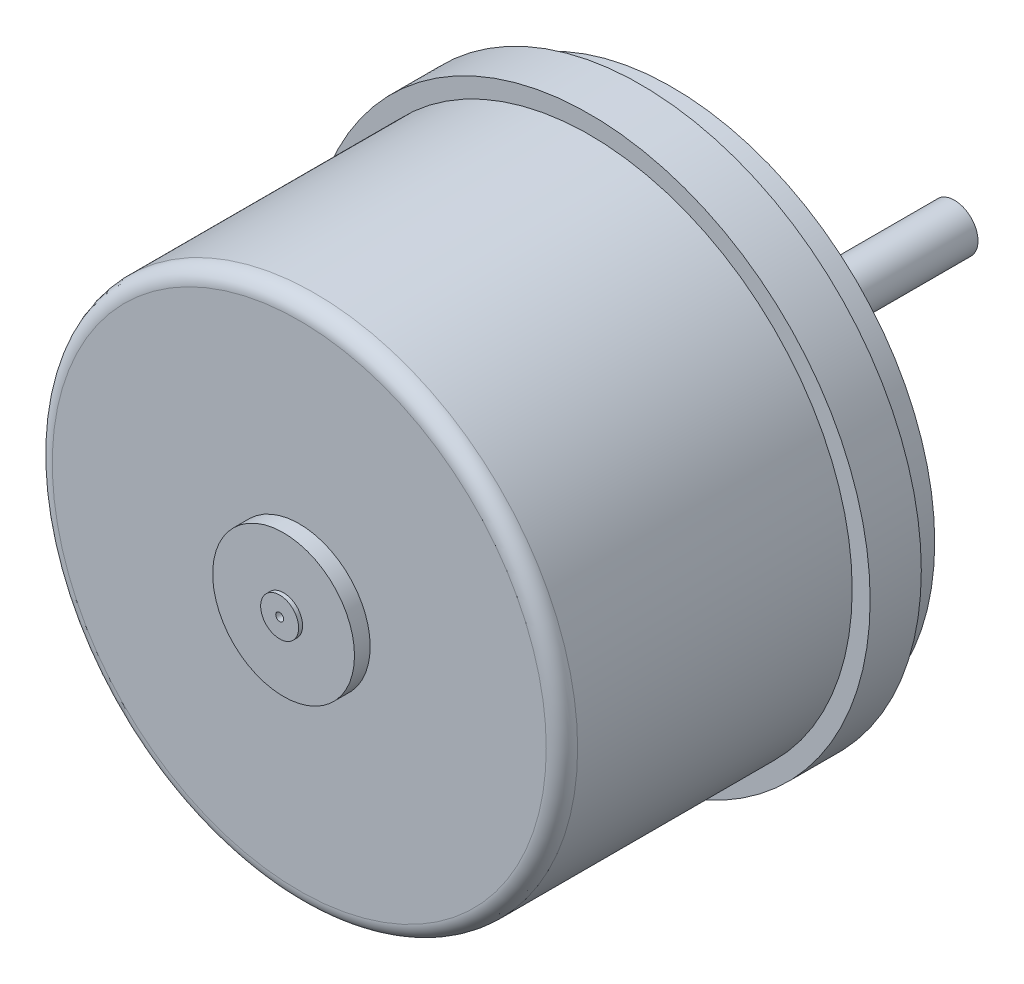
ISO-10303-21;
HEADER;
FILE_DESCRIPTION(('STEP AP214'),'2;1');
FILE_NAME('part.step','',(''),(''),'','','');
FILE_SCHEMA(('AUTOMOTIVE_DESIGN { 1 0 10303 214 1 1 1 1 }'));
ENDSEC;
DATA;
#1=APPLICATION_CONTEXT('core data for automotive mechanical design processes');
#2=APPLICATION_PROTOCOL_DEFINITION('international standard','automotive_design',2000,#1);
#3=PRODUCT_CONTEXT('',#1,'mechanical');
#4=PRODUCT('Part','Part','',(#3));
#5=PRODUCT_RELATED_PRODUCT_CATEGORY('part','',(#4));
#6=PRODUCT_DEFINITION_FORMATION('','',#4);
#7=PRODUCT_DEFINITION_CONTEXT('part definition',#1,'design');
#8=PRODUCT_DEFINITION('design','',#6,#7);
#9=PRODUCT_DEFINITION_SHAPE('','',#8);
#10=(LENGTH_UNIT() NAMED_UNIT(*) SI_UNIT(.MILLI.,.METRE.));
#11=(NAMED_UNIT(*) PLANE_ANGLE_UNIT() SI_UNIT($,.RADIAN.));
#12=(NAMED_UNIT(*) SI_UNIT($,.STERADIAN.) SOLID_ANGLE_UNIT());
#13=UNCERTAINTY_MEASURE_WITH_UNIT(LENGTH_MEASURE(1.E-05),#10,'distance_accuracy_value','');
#14=(GEOMETRIC_REPRESENTATION_CONTEXT(3) GLOBAL_UNCERTAINTY_ASSIGNED_CONTEXT((#13)) GLOBAL_UNIT_ASSIGNED_CONTEXT((#10,
#11,#12)) REPRESENTATION_CONTEXT('',''));
#15=CARTESIAN_POINT('',(0.,0.,0.));
#16=DIRECTION('',(0.,0.,1.));
#17=DIRECTION('',(1.,0.,0.));
#18=AXIS2_PLACEMENT_3D('',#15,#16,#17);
#19=CARTESIAN_POINT('',(0.,0.,2.));
#20=DIRECTION('',(0.,0.,-1.));
#21=DIRECTION('',(-1.,0.,0.));
#22=AXIS2_PLACEMENT_3D('',#19,#20,#21);
#23=CYLINDRICAL_SURFACE('',#22,33.485);
#24=CARTESIAN_POINT('',(0.,0.,2.));
#25=DIRECTION('',(0.,0.,1.));
#26=DIRECTION('',(1.,0.,0.));
#27=AXIS2_PLACEMENT_3D('',#24,#25,#26);
#28=CIRCLE('',#27,33.485);
#29=CARTESIAN_POINT('',(33.485,0.,2.));
#30=VERTEX_POINT('',#29);
#31=EDGE_CURVE('E46',#30,#30,#28,.T.);
#32=ORIENTED_EDGE('',*,*,#31,.F.);
#33=EDGE_LOOP('',(#32));
#34=FACE_BOUND('',#33,.T.);
#35=CARTESIAN_POINT('',(0.,0.,-2.));
#36=DIRECTION('',(0.,0.,1.));
#37=DIRECTION('',(1.,0.,0.));
#38=AXIS2_PLACEMENT_3D('',#35,#36,#37);
#39=CIRCLE('',#38,33.485);
#40=CARTESIAN_POINT('',(33.485,0.,-2.));
#41=VERTEX_POINT('',#40);
#42=EDGE_CURVE('E49',#41,#41,#39,.T.);
#43=ORIENTED_EDGE('',*,*,#42,.T.);
#44=EDGE_LOOP('',(#43));
#45=FACE_BOUND('',#44,.T.);
#46=ADVANCED_FACE('F31',(#34,#45),#23,.T.);
#47=CARTESIAN_POINT('',(0.,0.,-2.));
#48=DIRECTION('',(0.,0.,1.));
#49=DIRECTION('',(1.,0.,0.));
#50=AXIS2_PLACEMENT_3D('',#47,#48,#49);
#51=PLANE('',#50);
#52=CARTESIAN_POINT('',(0.,0.,-2.));
#53=DIRECTION('',(0.,0.,1.));
#54=DIRECTION('',(1.,0.,0.));
#55=AXIS2_PLACEMENT_3D('',#52,#53,#54);
#56=CIRCLE('',#55,3.);
#57=CARTESIAN_POINT('',(3.,0.,-2.));
#58=VERTEX_POINT('',#57);
#59=EDGE_CURVE('E42',#58,#58,#56,.F.);
#60=ORIENTED_EDGE('',*,*,#59,.F.);
#61=EDGE_LOOP('',(#60));
#62=FACE_BOUND('',#61,.T.);
#63=ORIENTED_EDGE('',*,*,#42,.F.);
#64=EDGE_LOOP('',(#63));
#65=FACE_BOUND('',#64,.T.);
#66=ADVANCED_FACE('F94',(#62,#65),#51,.F.);
#67=CARTESIAN_POINT('',(0.,0.,8.52));
#68=DIRECTION('',(0.,0.,-1.));
#69=DIRECTION('',(-1.,0.,0.));
#70=AXIS2_PLACEMENT_3D('',#67,#68,#69);
#71=CYLINDRICAL_SURFACE('',#70,35.775);
#72=CARTESIAN_POINT('',(0.,0.,8.52));
#73=DIRECTION('',(0.,0.,1.));
#74=DIRECTION('',(1.,0.,0.));
#75=AXIS2_PLACEMENT_3D('',#72,#73,#74);
#76=CIRCLE('',#75,35.775);
#77=CARTESIAN_POINT('',(35.775,0.,8.52));
#78=VERTEX_POINT('',#77);
#79=EDGE_CURVE('E52',#78,#78,#76,.T.);
#80=ORIENTED_EDGE('',*,*,#79,.F.);
#81=EDGE_LOOP('',(#80));
#82=FACE_BOUND('',#81,.T.);
#83=CARTESIAN_POINT('',(0.,0.,2.));
#84=DIRECTION('',(0.,0.,1.));
#85=DIRECTION('',(1.,0.,0.));
#86=AXIS2_PLACEMENT_3D('',#83,#84,#85);
#87=CIRCLE('',#86,35.775);
#88=CARTESIAN_POINT('',(35.775,0.,2.));
#89=VERTEX_POINT('',#88);
#90=EDGE_CURVE('E55',#89,#89,#87,.T.);
#91=ORIENTED_EDGE('',*,*,#90,.T.);
#92=EDGE_LOOP('',(#91));
#93=FACE_BOUND('',#92,.T.);
#94=ADVANCED_FACE('F97',(#82,#93),#71,.T.);
#95=CARTESIAN_POINT('',(0.,0.,8.52));
#96=DIRECTION('',(0.,0.,1.));
#97=DIRECTION('',(1.,0.,0.));
#98=AXIS2_PLACEMENT_3D('',#95,#96,#97);
#99=PLANE('',#98);
#100=CARTESIAN_POINT('',(0.,0.,8.52));
#101=DIRECTION('',(0.,0.,1.));
#102=DIRECTION('',(1.,0.,0.));
#103=AXIS2_PLACEMENT_3D('',#100,#101,#102);
#104=CIRCLE('',#103,33.485);
#105=CARTESIAN_POINT('',(33.485,0.,8.52));
#106=VERTEX_POINT('',#105);
#107=EDGE_CURVE('E58',#106,#106,#104,.T.);
#108=ORIENTED_EDGE('',*,*,#107,.F.);
#109=EDGE_LOOP('',(#108));
#110=FACE_BOUND('',#109,.T.);
#111=ORIENTED_EDGE('',*,*,#79,.T.);
#112=EDGE_LOOP('',(#111));
#113=FACE_BOUND('',#112,.T.);
#114=ADVANCED_FACE('F109',(#110,#113),#99,.T.);
#115=CARTESIAN_POINT('',(0.,0.,2.));
#116=DIRECTION('',(0.,0.,1.));
#117=DIRECTION('',(1.,0.,0.));
#118=AXIS2_PLACEMENT_3D('',#115,#116,#117);
#119=PLANE('',#118);
#120=ORIENTED_EDGE('',*,*,#31,.T.);
#121=EDGE_LOOP('',(#120));
#122=FACE_BOUND('',#121,.T.);
#123=ORIENTED_EDGE('',*,*,#90,.F.);
#124=EDGE_LOOP('',(#123));
#125=FACE_BOUND('',#124,.T.);
#126=ADVANCED_FACE('F111',(#122,#125),#119,.F.);
#127=CARTESIAN_POINT('',(0.,0.,45.52));
#128=DIRECTION('',(0.,0.,-1.));
#129=DIRECTION('',(-1.,0.,0.));
#130=AXIS2_PLACEMENT_3D('',#127,#128,#129);
#131=CYLINDRICAL_SURFACE('',#130,33.485);
#132=CARTESIAN_POINT('',(0.,0.,43.52));
#133=DIRECTION('',(0.,0.,1.));
#134=DIRECTION('',(1.,0.,0.));
#135=AXIS2_PLACEMENT_3D('',#132,#133,#134);
#136=CIRCLE('',#135,33.485);
#137=CARTESIAN_POINT('',(33.485,0.,43.52));
#138=VERTEX_POINT('',#137);
#139=EDGE_CURVE('E10',#138,#138,#136,.F.);
#140=ORIENTED_EDGE('',*,*,#139,.T.);
#141=EDGE_LOOP('',(#140));
#142=FACE_BOUND('',#141,.T.);
#143=ORIENTED_EDGE('',*,*,#107,.T.);
#144=EDGE_LOOP('',(#143));
#145=FACE_BOUND('',#144,.T.);
#146=ADVANCED_FACE('F114',(#142,#145),#131,.T.);
#147=CARTESIAN_POINT('',(0.,0.,45.52));
#148=DIRECTION('',(0.,0.,1.));
#149=DIRECTION('',(1.,0.,0.));
#150=AXIS2_PLACEMENT_3D('',#147,#148,#149);
#151=PLANE('',#150);
#152=CARTESIAN_POINT('',(0.,0.,45.52));
#153=DIRECTION('',(0.,0.,1.));
#154=DIRECTION('',(1.,0.,0.));
#155=AXIS2_PLACEMENT_3D('',#152,#153,#154);
#156=CIRCLE('',#155,31.485);
#157=CARTESIAN_POINT('',(31.485,0.,45.52));
#158=VERTEX_POINT('',#157);
#159=EDGE_CURVE('E38',#158,#158,#156,.T.);
#160=ORIENTED_EDGE('',*,*,#159,.T.);
#161=EDGE_LOOP('',(#160));
#162=FACE_BOUND('',#161,.T.);
#163=CARTESIAN_POINT('',(0.,0.,45.52));
#164=DIRECTION('',(0.,0.,1.));
#165=DIRECTION('',(1.,0.,0.));
#166=AXIS2_PLACEMENT_3D('',#163,#164,#165);
#167=CIRCLE('',#166,9.04);
#168=CARTESIAN_POINT('',(9.04,0.,45.52));
#169=VERTEX_POINT('',#168);
#170=EDGE_CURVE('E64',#169,#169,#167,.T.);
#171=ORIENTED_EDGE('',*,*,#170,.F.);
#172=EDGE_LOOP('',(#171));
#173=FACE_BOUND('',#172,.T.);
#174=ADVANCED_FACE('F121',(#162,#173),#151,.T.);
#175=CARTESIAN_POINT('',(0.,0.,47.52));
#176=DIRECTION('',(0.,0.,-1.));
#177=DIRECTION('',(-1.,0.,0.));
#178=AXIS2_PLACEMENT_3D('',#175,#176,#177);
#179=CYLINDRICAL_SURFACE('',#178,9.04);
#180=CARTESIAN_POINT('',(0.,0.,47.52));
#181=DIRECTION('',(0.,0.,1.));
#182=DIRECTION('',(1.,0.,0.));
#183=AXIS2_PLACEMENT_3D('',#180,#181,#182);
#184=CIRCLE('',#183,9.04);
#185=CARTESIAN_POINT('',(9.04,0.,47.52));
#186=VERTEX_POINT('',#185);
#187=EDGE_CURVE('E63',#186,#186,#184,.T.);
#188=ORIENTED_EDGE('',*,*,#187,.F.);
#189=EDGE_LOOP('',(#188));
#190=FACE_BOUND('',#189,.T.);
#191=ORIENTED_EDGE('',*,*,#170,.T.);
#192=EDGE_LOOP('',(#191));
#193=FACE_BOUND('',#192,.T.);
#194=ADVANCED_FACE('F124',(#190,#193),#179,.T.);
#195=CARTESIAN_POINT('',(0.,0.,47.52));
#196=DIRECTION('',(0.,0.,1.));
#197=DIRECTION('',(1.,0.,0.));
#198=AXIS2_PLACEMENT_3D('',#195,#196,#197);
#199=PLANE('',#198);
#200=CARTESIAN_POINT('',(0.,0.,47.52));
#201=DIRECTION('',(0.,0.,1.));
#202=DIRECTION('',(1.,0.,0.));
#203=AXIS2_PLACEMENT_3D('',#200,#201,#202);
#204=CIRCLE('',#203,2.425);
#205=CARTESIAN_POINT('',(2.425,0.,47.52));
#206=VERTEX_POINT('',#205);
#207=EDGE_CURVE('E70',#206,#206,#204,.T.);
#208=ORIENTED_EDGE('',*,*,#207,.F.);
#209=EDGE_LOOP('',(#208));
#210=FACE_BOUND('',#209,.T.);
#211=ORIENTED_EDGE('',*,*,#187,.T.);
#212=EDGE_LOOP('',(#211));
#213=FACE_BOUND('',#212,.T.);
#214=ADVANCED_FACE('F127',(#210,#213),#199,.T.);
#215=CARTESIAN_POINT('',(0.,0.,48.02));
#216=DIRECTION('',(0.,0.,-1.));
#217=DIRECTION('',(-1.,0.,0.));
#218=AXIS2_PLACEMENT_3D('',#215,#216,#217);
#219=CYLINDRICAL_SURFACE('',#218,2.425);
#220=CARTESIAN_POINT('',(0.,0.,48.02));
#221=DIRECTION('',(0.,0.,1.));
#222=DIRECTION('',(1.,0.,0.));
#223=AXIS2_PLACEMENT_3D('',#220,#221,#222);
#224=CIRCLE('',#223,2.425);
#225=CARTESIAN_POINT('',(2.425,0.,48.02));
#226=VERTEX_POINT('',#225);
#227=EDGE_CURVE('E67',#226,#226,#224,.T.);
#228=ORIENTED_EDGE('',*,*,#227,.F.);
#229=EDGE_LOOP('',(#228));
#230=FACE_BOUND('',#229,.T.);
#231=ORIENTED_EDGE('',*,*,#207,.T.);
#232=EDGE_LOOP('',(#231));
#233=FACE_BOUND('',#232,.T.);
#234=ADVANCED_FACE('F131',(#230,#233),#219,.T.);
#235=CARTESIAN_POINT('',(0.,0.,48.02));
#236=DIRECTION('',(0.,0.,1.));
#237=DIRECTION('',(1.,0.,0.));
#238=AXIS2_PLACEMENT_3D('',#235,#236,#237);
#239=PLANE('',#238);
#240=CARTESIAN_POINT('',(0.,0.,48.02));
#241=DIRECTION('',(0.,0.,1.));
#242=DIRECTION('',(1.,0.,0.));
#243=AXIS2_PLACEMENT_3D('',#240,#241,#242);
#244=CIRCLE('',#243,0.5);
#245=CARTESIAN_POINT('',(0.5,0.,48.02));
#246=VERTEX_POINT('',#245);
#247=EDGE_CURVE('E76',#246,#246,#244,.T.);
#248=ORIENTED_EDGE('',*,*,#247,.F.);
#249=EDGE_LOOP('',(#248));
#250=FACE_BOUND('',#249,.T.);
#251=ORIENTED_EDGE('',*,*,#227,.T.);
#252=EDGE_LOOP('',(#251));
#253=FACE_BOUND('',#252,.T.);
#254=ADVANCED_FACE('F135',(#250,#253),#239,.T.);
#255=CARTESIAN_POINT('',(0.,0.,47.02));
#256=DIRECTION('',(0.,0.,1.));
#257=DIRECTION('',(1.,0.,0.));
#258=AXIS2_PLACEMENT_3D('',#255,#256,#257);
#259=CYLINDRICAL_SURFACE('',#258,0.5);
#260=CARTESIAN_POINT('',(0.,0.,47.02));
#261=DIRECTION('',(0.,0.,1.));
#262=DIRECTION('',(1.,0.,0.));
#263=AXIS2_PLACEMENT_3D('',#260,#261,#262);
#264=CIRCLE('',#263,0.5);
#265=CARTESIAN_POINT('',(0.5,0.,47.02));
#266=VERTEX_POINT('',#265);
#267=EDGE_CURVE('E73',#266,#266,#264,.T.);
#268=ORIENTED_EDGE('',*,*,#267,.F.);
#269=EDGE_LOOP('',(#268));
#270=FACE_BOUND('',#269,.T.);
#271=ORIENTED_EDGE('',*,*,#247,.T.);
#272=EDGE_LOOP('',(#271));
#273=FACE_BOUND('',#272,.T.);
#274=ADVANCED_FACE('F139',(#270,#273),#259,.F.);
#275=CARTESIAN_POINT('',(0.,0.,47.02));
#276=DIRECTION('',(0.,0.,1.));
#277=DIRECTION('',(1.,0.,0.));
#278=AXIS2_PLACEMENT_3D('',#275,#276,#277);
#279=PLANE('',#278);
#280=ORIENTED_EDGE('',*,*,#267,.T.);
#281=EDGE_LOOP('',(#280));
#282=FACE_BOUND('',#281,.T.);
#283=ADVANCED_FACE('F90',(#282),#279,.T.);
#284=CARTESIAN_POINT('',(0.,0.,-38.));
#285=DIRECTION('',(0.,0.,1.));
#286=DIRECTION('',(1.,0.,0.));
#287=AXIS2_PLACEMENT_3D('',#284,#285,#286);
#288=CYLINDRICAL_SURFACE('',#287,3.);
#289=CARTESIAN_POINT('',(0.,0.,-38.));
#290=DIRECTION('',(0.,0.,-1.));
#291=DIRECTION('',(-1.,0.,0.));
#292=AXIS2_PLACEMENT_3D('',#289,#290,#291);
#293=CIRCLE('',#292,3.);
#294=CARTESIAN_POINT('',(-3.,0.,-38.));
#295=VERTEX_POINT('',#294);
#296=EDGE_CURVE('E79',#295,#295,#293,.T.);
#297=ORIENTED_EDGE('',*,*,#296,.F.);
#298=EDGE_LOOP('',(#297));
#299=FACE_BOUND('',#298,.T.);
#300=ORIENTED_EDGE('',*,*,#59,.T.);
#301=EDGE_LOOP('',(#300));
#302=FACE_BOUND('',#301,.T.);
#303=ADVANCED_FACE('F87',(#299,#302),#288,.T.);
#304=CARTESIAN_POINT('',(0.,0.,-38.));
#305=DIRECTION('',(0.,0.,-1.));
#306=DIRECTION('',(-1.,0.,0.));
#307=AXIS2_PLACEMENT_3D('',#304,#305,#306);
#308=PLANE('',#307);
#309=ORIENTED_EDGE('',*,*,#296,.T.);
#310=EDGE_LOOP('',(#309));
#311=FACE_BOUND('',#310,.T.);
#312=ADVANCED_FACE('F85',(#311),#308,.T.);
#313=CARTESIAN_POINT('',(0.,0.,43.52));
#314=DIRECTION('',(0.,0.,1.));
#315=DIRECTION('',(1.,0.,0.));
#316=AXIS2_PLACEMENT_3D('',#313,#314,#315);
#317=TOROIDAL_SURFACE('',#316,31.485,2.);
#318=ORIENTED_EDGE('',*,*,#139,.F.);
#319=EDGE_LOOP('',(#318));
#320=FACE_BOUND('',#319,.T.);
#321=ORIENTED_EDGE('',*,*,#159,.F.);
#322=EDGE_LOOP('',(#321));
#323=FACE_BOUND('',#322,.T.);
#324=ADVANCED_FACE('F33',(#320,#323),#317,.T.);
#325=CLOSED_SHELL('',(#46,#66,#94,#114,#126,#146,#174,#194,#214,#234,#254,#274,#283,#303,#312,#324));
#326=MANIFOLD_SOLID_BREP('B2',#325);
#327=ADVANCED_BREP_SHAPE_REPRESENTATION('',(#18,#326),#14);
#328=SHAPE_DEFINITION_REPRESENTATION(#9,#327);
ENDSEC;
END-ISO-10303-21;
